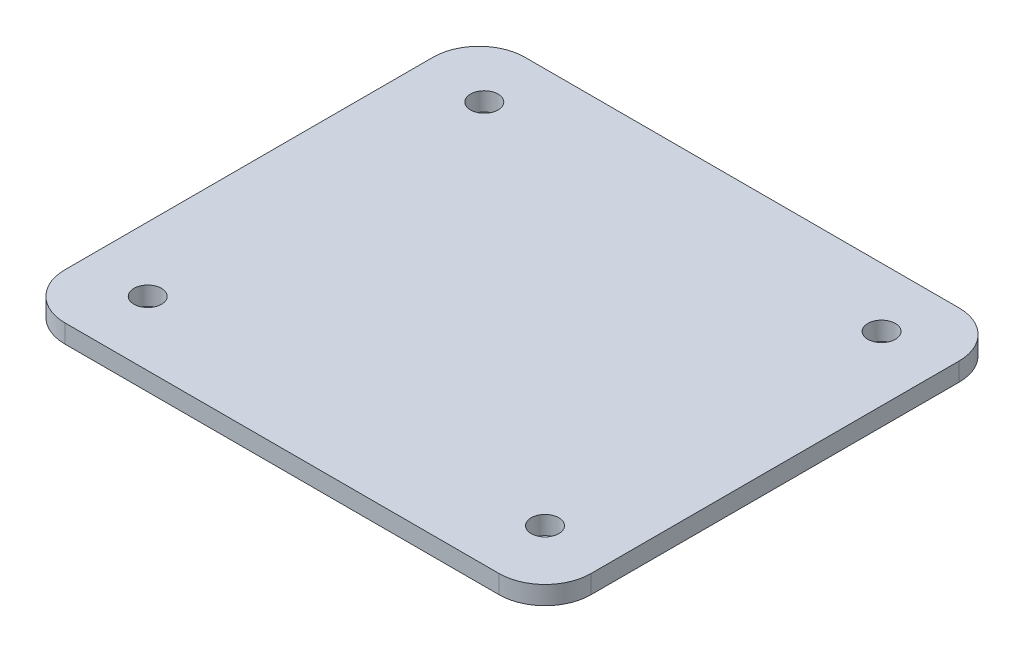
ISO-10303-21;
HEADER;
FILE_DESCRIPTION(('STEP AP214'),'2;1');
FILE_NAME('part.step','',(''),(''),'','','');
FILE_SCHEMA(('AUTOMOTIVE_DESIGN { 1 0 10303 214 1 1 1 1 }'));
ENDSEC;
DATA;
#1=APPLICATION_CONTEXT('core data for automotive mechanical design processes');
#2=APPLICATION_PROTOCOL_DEFINITION('international standard','automotive_design',2000,#1);
#3=PRODUCT_CONTEXT('',#1,'mechanical');
#4=PRODUCT('Part','Part','',(#3));
#5=PRODUCT_RELATED_PRODUCT_CATEGORY('part','',(#4));
#6=PRODUCT_DEFINITION_FORMATION('','',#4);
#7=PRODUCT_DEFINITION_CONTEXT('part definition',#1,'design');
#8=PRODUCT_DEFINITION('design','',#6,#7);
#9=PRODUCT_DEFINITION_SHAPE('','',#8);
#10=(LENGTH_UNIT() NAMED_UNIT(*) SI_UNIT(.MILLI.,.METRE.));
#11=(NAMED_UNIT(*) PLANE_ANGLE_UNIT() SI_UNIT($,.RADIAN.));
#12=(NAMED_UNIT(*) SI_UNIT($,.STERADIAN.) SOLID_ANGLE_UNIT());
#13=UNCERTAINTY_MEASURE_WITH_UNIT(LENGTH_MEASURE(1.E-05),#10,'distance_accuracy_value','');
#14=(GEOMETRIC_REPRESENTATION_CONTEXT(3) GLOBAL_UNCERTAINTY_ASSIGNED_CONTEXT((#13)) GLOBAL_UNIT_ASSIGNED_CONTEXT((#10,
#11,#12)) REPRESENTATION_CONTEXT('',''));
#15=CARTESIAN_POINT('',(0.,0.,0.));
#16=DIRECTION('',(0.,0.,1.));
#17=DIRECTION('',(1.,0.,0.));
#18=AXIS2_PLACEMENT_3D('',#15,#16,#17);
#19=CARTESIAN_POINT('',(0.,2.,0.));
#20=DIRECTION('',(0.,1.,0.));
#21=DIRECTION('',(0.,0.,1.));
#22=AXIS2_PLACEMENT_3D('',#19,#20,#21);
#23=PLANE('',#22);
#24=CARTESIAN_POINT('',(50.18,2.,43.));
#25=DIRECTION('',(0.,1.,0.));
#26=DIRECTION('',(0.,0.,1.));
#27=AXIS2_PLACEMENT_3D('',#24,#25,#26);
#28=CIRCLE('',#27,1.5);
#29=CARTESIAN_POINT('',(50.18,2.,44.5));
#30=VERTEX_POINT('',#29);
#31=EDGE_CURVE('E176',#30,#30,#28,.T.);
#32=ORIENTED_EDGE('',*,*,#31,.F.);
#33=EDGE_LOOP('',(#32));
#34=FACE_BOUND('',#33,.T.);
#35=CARTESIAN_POINT('',(7.,2.,6.42));
#36=DIRECTION('',(0.,1.,0.));
#37=DIRECTION('',(0.,0.,1.));
#38=AXIS2_PLACEMENT_3D('',#35,#36,#37);
#39=CIRCLE('',#38,1.5);
#40=CARTESIAN_POINT('',(7.,2.,7.92));
#41=VERTEX_POINT('',#40);
#42=EDGE_CURVE('E159',#41,#41,#39,.T.);
#43=ORIENTED_EDGE('',*,*,#42,.F.);
#44=EDGE_LOOP('',(#43));
#45=FACE_BOUND('',#44,.T.);
#46=DIRECTION('',(0.,0.,-1.));
#47=VECTOR('',#46,1.);
#48=CARTESIAN_POINT('',(57.18,2.,0.));
#49=LINE('',#48,#47);
#50=CARTESIAN_POINT('',(57.18,2.,45.));
#51=VERTEX_POINT('',#50);
#52=CARTESIAN_POINT('',(57.18,2.,5.));
#53=VERTEX_POINT('',#52);
#54=EDGE_CURVE('E163',#51,#53,#49,.T.);
#55=ORIENTED_EDGE('',*,*,#54,.T.);
#56=CARTESIAN_POINT('',(52.18,2.,5.));
#57=DIRECTION('',(0.,1.,0.));
#58=DIRECTION('',(0.,0.,1.));
#59=AXIS2_PLACEMENT_3D('',#56,#57,#58);
#60=CIRCLE('',#59,5.);
#61=CARTESIAN_POINT('',(52.18,2.,0.));
#62=VERTEX_POINT('',#61);
#63=EDGE_CURVE('E146',#53,#62,#60,.T.);
#64=ORIENTED_EDGE('',*,*,#63,.T.);
#65=DIRECTION('',(-1.,0.,0.));
#66=VECTOR('',#65,1.);
#67=CARTESIAN_POINT('',(0.,2.,0.));
#68=LINE('',#67,#66);
#69=CARTESIAN_POINT('',(5.,2.,0.));
#70=VERTEX_POINT('',#69);
#71=EDGE_CURVE('E117',#62,#70,#68,.T.);
#72=ORIENTED_EDGE('',*,*,#71,.T.);
#73=CARTESIAN_POINT('',(5.,2.,5.));
#74=DIRECTION('',(0.,1.,0.));
#75=DIRECTION('',(0.,0.,1.));
#76=AXIS2_PLACEMENT_3D('',#73,#74,#75);
#77=CIRCLE('',#76,5.);
#78=CARTESIAN_POINT('',(0.,2.,5.));
#79=VERTEX_POINT('',#78);
#80=EDGE_CURVE('E144',#70,#79,#77,.T.);
#81=ORIENTED_EDGE('',*,*,#80,.T.);
#82=DIRECTION('',(0.,0.,1.));
#83=VECTOR('',#82,1.);
#84=CARTESIAN_POINT('',(0.,2.,0.));
#85=LINE('',#84,#83);
#86=CARTESIAN_POINT('',(0.,2.,45.));
#87=VERTEX_POINT('',#86);
#88=EDGE_CURVE('E124',#79,#87,#85,.T.);
#89=ORIENTED_EDGE('',*,*,#88,.T.);
#90=CARTESIAN_POINT('',(5.00000000000001,2.,45.));
#91=DIRECTION('',(0.,1.,0.));
#92=DIRECTION('',(0.,0.,1.));
#93=AXIS2_PLACEMENT_3D('',#90,#91,#92);
#94=CIRCLE('',#93,5.);
#95=CARTESIAN_POINT('',(5.00000000000001,2.,50.));
#96=VERTEX_POINT('',#95);
#97=EDGE_CURVE('E52',#87,#96,#94,.T.);
#98=ORIENTED_EDGE('',*,*,#97,.T.);
#99=DIRECTION('',(1.,0.,0.));
#100=VECTOR('',#99,1.);
#101=CARTESIAN_POINT('',(0.,2.,50.));
#102=LINE('',#101,#100);
#103=CARTESIAN_POINT('',(52.18,2.,50.));
#104=VERTEX_POINT('',#103);
#105=EDGE_CURVE('E127',#96,#104,#102,.T.);
#106=ORIENTED_EDGE('',*,*,#105,.T.);
#107=CARTESIAN_POINT('',(52.18,2.,45.));
#108=DIRECTION('',(0.,1.,0.));
#109=DIRECTION('',(0.,0.,1.));
#110=AXIS2_PLACEMENT_3D('',#107,#108,#109);
#111=CIRCLE('',#110,5.);
#112=EDGE_CURVE('E142',#104,#51,#111,.T.);
#113=ORIENTED_EDGE('',*,*,#112,.T.);
#114=EDGE_LOOP('',(#55,#64,#72,#81,#89,#98,#106,#113));
#115=FACE_BOUND('',#114,.T.);
#116=CARTESIAN_POINT('',(50.18,2.,6.42));
#117=DIRECTION('',(0.,1.,0.));
#118=DIRECTION('',(0.,0.,1.));
#119=AXIS2_PLACEMENT_3D('',#116,#117,#118);
#120=CIRCLE('',#119,1.5);
#121=CARTESIAN_POINT('',(50.18,2.,7.92000000000001));
#122=VERTEX_POINT('',#121);
#123=EDGE_CURVE('E170',#122,#122,#120,.T.);
#124=ORIENTED_EDGE('',*,*,#123,.F.);
#125=EDGE_LOOP('',(#124));
#126=FACE_BOUND('',#125,.T.);
#127=CARTESIAN_POINT('',(7.,2.,43.));
#128=DIRECTION('',(0.,1.,0.));
#129=DIRECTION('',(0.,0.,1.));
#130=AXIS2_PLACEMENT_3D('',#127,#128,#129);
#131=CIRCLE('',#130,1.5);
#132=CARTESIAN_POINT('',(7.,2.,44.5));
#133=VERTEX_POINT('',#132);
#134=EDGE_CURVE('E182',#133,#133,#131,.T.);
#135=ORIENTED_EDGE('',*,*,#134,.F.);
#136=EDGE_LOOP('',(#135));
#137=FACE_BOUND('',#136,.T.);
#138=ADVANCED_FACE('F32',(#34,#45,#115,#126,#137),#23,.T.);
#139=CARTESIAN_POINT('',(0.,0.,0.));
#140=DIRECTION('',(0.,1.,0.));
#141=DIRECTION('',(0.,0.,1.));
#142=AXIS2_PLACEMENT_3D('',#139,#140,#141);
#143=PLANE('',#142);
#144=DIRECTION('',(-1.,0.,0.));
#145=VECTOR('',#144,1.);
#146=CARTESIAN_POINT('',(0.,0.,0.));
#147=LINE('',#146,#145);
#148=CARTESIAN_POINT('',(52.18,0.,0.));
#149=VERTEX_POINT('',#148);
#150=CARTESIAN_POINT('',(5.,0.,0.));
#151=VERTEX_POINT('',#150);
#152=EDGE_CURVE('E114',#149,#151,#147,.T.);
#153=ORIENTED_EDGE('',*,*,#152,.F.);
#154=CARTESIAN_POINT('',(52.18,0.,5.));
#155=DIRECTION('',(0.,1.,0.));
#156=DIRECTION('',(0.,0.,1.));
#157=AXIS2_PLACEMENT_3D('',#154,#155,#156);
#158=CIRCLE('',#157,5.);
#159=CARTESIAN_POINT('',(57.18,0.,5.));
#160=VERTEX_POINT('',#159);
#161=EDGE_CURVE('E97',#149,#160,#158,.F.);
#162=ORIENTED_EDGE('',*,*,#161,.T.);
#163=DIRECTION('',(0.,0.,-1.));
#164=VECTOR('',#163,1.);
#165=CARTESIAN_POINT('',(57.18,0.,0.));
#166=LINE('',#165,#164);
#167=CARTESIAN_POINT('',(57.18,0.,45.));
#168=VERTEX_POINT('',#167);
#169=EDGE_CURVE('E125',#168,#160,#166,.T.);
#170=ORIENTED_EDGE('',*,*,#169,.F.);
#171=CARTESIAN_POINT('',(52.18,0.,45.));
#172=DIRECTION('',(0.,1.,0.));
#173=DIRECTION('',(0.,0.,1.));
#174=AXIS2_PLACEMENT_3D('',#171,#172,#173);
#175=CIRCLE('',#174,5.);
#176=CARTESIAN_POINT('',(52.18,0.,50.));
#177=VERTEX_POINT('',#176);
#178=EDGE_CURVE('E135',#168,#177,#175,.F.);
#179=ORIENTED_EDGE('',*,*,#178,.T.);
#180=DIRECTION('',(1.,0.,0.));
#181=VECTOR('',#180,1.);
#182=CARTESIAN_POINT('',(0.,0.,50.));
#183=LINE('',#182,#181);
#184=CARTESIAN_POINT('',(5.00000000000001,0.,50.));
#185=VERTEX_POINT('',#184);
#186=EDGE_CURVE('E129',#185,#177,#183,.T.);
#187=ORIENTED_EDGE('',*,*,#186,.F.);
#188=CARTESIAN_POINT('',(5.00000000000001,0.,45.));
#189=DIRECTION('',(0.,1.,0.));
#190=DIRECTION('',(0.,0.,1.));
#191=AXIS2_PLACEMENT_3D('',#188,#189,#190);
#192=CIRCLE('',#191,5.);
#193=CARTESIAN_POINT('',(0.,0.,45.));
#194=VERTEX_POINT('',#193);
#195=EDGE_CURVE('E118',#185,#194,#192,.F.);
#196=ORIENTED_EDGE('',*,*,#195,.T.);
#197=DIRECTION('',(0.,0.,1.));
#198=VECTOR('',#197,1.);
#199=CARTESIAN_POINT('',(0.,0.,0.));
#200=LINE('',#199,#198);
#201=CARTESIAN_POINT('',(0.,0.,5.));
#202=VERTEX_POINT('',#201);
#203=EDGE_CURVE('E158',#202,#194,#200,.T.);
#204=ORIENTED_EDGE('',*,*,#203,.F.);
#205=CARTESIAN_POINT('',(5.,0.,5.));
#206=DIRECTION('',(0.,1.,0.));
#207=DIRECTION('',(0.,0.,1.));
#208=AXIS2_PLACEMENT_3D('',#205,#206,#207);
#209=CIRCLE('',#208,5.);
#210=EDGE_CURVE('E108',#202,#151,#209,.F.);
#211=ORIENTED_EDGE('',*,*,#210,.T.);
#212=EDGE_LOOP('',(#153,#162,#170,#179,#187,#196,#204,#211));
#213=FACE_BOUND('',#212,.T.);
#214=CARTESIAN_POINT('',(7.,0.,6.42));
#215=DIRECTION('',(0.,1.,0.));
#216=DIRECTION('',(0.,0.,1.));
#217=AXIS2_PLACEMENT_3D('',#214,#215,#216);
#218=CIRCLE('',#217,1.5);
#219=CARTESIAN_POINT('',(7.,0.,7.92));
#220=VERTEX_POINT('',#219);
#221=EDGE_CURVE('E167',#220,#220,#218,.T.);
#222=ORIENTED_EDGE('',*,*,#221,.T.);
#223=EDGE_LOOP('',(#222));
#224=FACE_BOUND('',#223,.T.);
#225=CARTESIAN_POINT('',(50.18,0.,6.42));
#226=DIRECTION('',(0.,1.,0.));
#227=DIRECTION('',(0.,0.,1.));
#228=AXIS2_PLACEMENT_3D('',#225,#226,#227);
#229=CIRCLE('',#228,1.5);
#230=CARTESIAN_POINT('',(50.18,0.,7.92000000000001));
#231=VERTEX_POINT('',#230);
#232=EDGE_CURVE('E173',#231,#231,#229,.T.);
#233=ORIENTED_EDGE('',*,*,#232,.T.);
#234=EDGE_LOOP('',(#233));
#235=FACE_BOUND('',#234,.T.);
#236=CARTESIAN_POINT('',(50.18,0.,43.));
#237=DIRECTION('',(0.,1.,0.));
#238=DIRECTION('',(0.,0.,1.));
#239=AXIS2_PLACEMENT_3D('',#236,#237,#238);
#240=CIRCLE('',#239,1.5);
#241=CARTESIAN_POINT('',(50.18,0.,44.5));
#242=VERTEX_POINT('',#241);
#243=EDGE_CURVE('E179',#242,#242,#240,.T.);
#244=ORIENTED_EDGE('',*,*,#243,.T.);
#245=EDGE_LOOP('',(#244));
#246=FACE_BOUND('',#245,.T.);
#247=CARTESIAN_POINT('',(7.,0.,43.));
#248=DIRECTION('',(0.,1.,0.));
#249=DIRECTION('',(0.,0.,1.));
#250=AXIS2_PLACEMENT_3D('',#247,#248,#249);
#251=CIRCLE('',#250,1.5);
#252=CARTESIAN_POINT('',(7.,0.,44.5));
#253=VERTEX_POINT('',#252);
#254=EDGE_CURVE('E185',#253,#253,#251,.T.);
#255=ORIENTED_EDGE('',*,*,#254,.T.);
#256=EDGE_LOOP('',(#255));
#257=FACE_BOUND('',#256,.T.);
#258=ADVANCED_FACE('F121',(#213,#224,#235,#246,#257),#143,.F.);
#259=CARTESIAN_POINT('',(0.,2.,0.));
#260=DIRECTION('',(1.,0.,0.));
#261=DIRECTION('',(0.,0.,-1.));
#262=AXIS2_PLACEMENT_3D('',#259,#260,#261);
#263=PLANE('',#262);
#264=ORIENTED_EDGE('',*,*,#88,.F.);
#265=DIRECTION('',(0.,-1.,0.));
#266=VECTOR('',#265,1.);
#267=CARTESIAN_POINT('',(0.,2.,5.));
#268=LINE('',#267,#266);
#269=EDGE_CURVE('E150',#79,#202,#268,.T.);
#270=ORIENTED_EDGE('',*,*,#269,.T.);
#271=ORIENTED_EDGE('',*,*,#203,.T.);
#272=DIRECTION('',(0.,-1.,0.));
#273=VECTOR('',#272,1.);
#274=CARTESIAN_POINT('',(0.,2.,45.));
#275=LINE('',#274,#273);
#276=EDGE_CURVE('E148',#194,#87,#275,.F.);
#277=ORIENTED_EDGE('',*,*,#276,.T.);
#278=EDGE_LOOP('',(#264,#270,#271,#277));
#279=FACE_BOUND('',#278,.T.);
#280=ADVANCED_FACE('F200',(#279),#263,.F.);
#281=CARTESIAN_POINT('',(0.,2.,50.));
#282=DIRECTION('',(0.,0.,-1.));
#283=DIRECTION('',(-1.,0.,0.));
#284=AXIS2_PLACEMENT_3D('',#281,#282,#283);
#285=PLANE('',#284);
#286=ORIENTED_EDGE('',*,*,#186,.T.);
#287=DIRECTION('',(0.,-1.,0.));
#288=VECTOR('',#287,1.);
#289=CARTESIAN_POINT('',(52.18,2.,50.));
#290=LINE('',#289,#288);
#291=EDGE_CURVE('E11',#177,#104,#290,.F.);
#292=ORIENTED_EDGE('',*,*,#291,.T.);
#293=ORIENTED_EDGE('',*,*,#105,.F.);
#294=DIRECTION('',(0.,-1.,0.));
#295=VECTOR('',#294,1.);
#296=CARTESIAN_POINT('',(5.00000000000001,2.,50.));
#297=LINE('',#296,#295);
#298=EDGE_CURVE('E40',#96,#185,#297,.T.);
#299=ORIENTED_EDGE('',*,*,#298,.T.);
#300=EDGE_LOOP('',(#286,#292,#293,#299));
#301=FACE_BOUND('',#300,.T.);
#302=ADVANCED_FACE('F155',(#301),#285,.F.);
#303=CARTESIAN_POINT('',(57.18,2.,0.));
#304=DIRECTION('',(-1.,0.,0.));
#305=DIRECTION('',(0.,0.,1.));
#306=AXIS2_PLACEMENT_3D('',#303,#304,#305);
#307=PLANE('',#306);
#308=ORIENTED_EDGE('',*,*,#169,.T.);
#309=DIRECTION('',(0.,-1.,0.));
#310=VECTOR('',#309,1.);
#311=CARTESIAN_POINT('',(57.18,2.,5.));
#312=LINE('',#311,#310);
#313=EDGE_CURVE('E102',#160,#53,#312,.F.);
#314=ORIENTED_EDGE('',*,*,#313,.T.);
#315=ORIENTED_EDGE('',*,*,#54,.F.);
#316=DIRECTION('',(0.,-1.,0.));
#317=VECTOR('',#316,1.);
#318=CARTESIAN_POINT('',(57.18,2.,45.));
#319=LINE('',#318,#317);
#320=EDGE_CURVE('E107',#51,#168,#319,.T.);
#321=ORIENTED_EDGE('',*,*,#320,.T.);
#322=EDGE_LOOP('',(#308,#314,#315,#321));
#323=FACE_BOUND('',#322,.T.);
#324=ADVANCED_FACE('F210',(#323),#307,.F.);
#325=CARTESIAN_POINT('',(0.,2.,0.));
#326=DIRECTION('',(0.,0.,1.));
#327=DIRECTION('',(1.,0.,0.));
#328=AXIS2_PLACEMENT_3D('',#325,#326,#327);
#329=PLANE('',#328);
#330=ORIENTED_EDGE('',*,*,#71,.F.);
#331=DIRECTION('',(0.,-1.,0.));
#332=VECTOR('',#331,1.);
#333=CARTESIAN_POINT('',(52.18,2.,0.));
#334=LINE('',#333,#332);
#335=EDGE_CURVE('E101',#62,#149,#334,.T.);
#336=ORIENTED_EDGE('',*,*,#335,.T.);
#337=ORIENTED_EDGE('',*,*,#152,.T.);
#338=DIRECTION('',(0.,-1.,0.));
#339=VECTOR('',#338,1.);
#340=CARTESIAN_POINT('',(5.,2.,0.));
#341=LINE('',#340,#339);
#342=EDGE_CURVE('E119',#151,#70,#341,.F.);
#343=ORIENTED_EDGE('',*,*,#342,.T.);
#344=EDGE_LOOP('',(#330,#336,#337,#343));
#345=FACE_BOUND('',#344,.T.);
#346=ADVANCED_FACE('F113',(#345),#329,.F.);
#347=CARTESIAN_POINT('',(7.,2.,6.42));
#348=DIRECTION('',(0.,-1.,0.));
#349=DIRECTION('',(0.,0.,-1.));
#350=AXIS2_PLACEMENT_3D('',#347,#348,#349);
#351=CYLINDRICAL_SURFACE('',#350,1.5);
#352=ORIENTED_EDGE('',*,*,#42,.T.);
#353=EDGE_LOOP('',(#352));
#354=FACE_BOUND('',#353,.T.);
#355=ORIENTED_EDGE('',*,*,#221,.F.);
#356=EDGE_LOOP('',(#355));
#357=FACE_BOUND('',#356,.T.);
#358=ADVANCED_FACE('F205',(#354,#357),#351,.F.);
#359=CARTESIAN_POINT('',(50.18,2.,6.42));
#360=DIRECTION('',(0.,-1.,0.));
#361=DIRECTION('',(0.,0.,-1.));
#362=AXIS2_PLACEMENT_3D('',#359,#360,#361);
#363=CYLINDRICAL_SURFACE('',#362,1.5);
#364=ORIENTED_EDGE('',*,*,#123,.T.);
#365=EDGE_LOOP('',(#364));
#366=FACE_BOUND('',#365,.T.);
#367=ORIENTED_EDGE('',*,*,#232,.F.);
#368=EDGE_LOOP('',(#367));
#369=FACE_BOUND('',#368,.T.);
#370=ADVANCED_FACE('F240',(#366,#369),#363,.F.);
#371=CARTESIAN_POINT('',(50.18,2.,43.));
#372=DIRECTION('',(0.,-1.,0.));
#373=DIRECTION('',(0.,0.,-1.));
#374=AXIS2_PLACEMENT_3D('',#371,#372,#373);
#375=CYLINDRICAL_SURFACE('',#374,1.5);
#376=ORIENTED_EDGE('',*,*,#31,.T.);
#377=EDGE_LOOP('',(#376));
#378=FACE_BOUND('',#377,.T.);
#379=ORIENTED_EDGE('',*,*,#243,.F.);
#380=EDGE_LOOP('',(#379));
#381=FACE_BOUND('',#380,.T.);
#382=ADVANCED_FACE('F243',(#378,#381),#375,.F.);
#383=CARTESIAN_POINT('',(7.,2.,43.));
#384=DIRECTION('',(0.,-1.,0.));
#385=DIRECTION('',(0.,0.,-1.));
#386=AXIS2_PLACEMENT_3D('',#383,#384,#385);
#387=CYLINDRICAL_SURFACE('',#386,1.5);
#388=ORIENTED_EDGE('',*,*,#134,.T.);
#389=EDGE_LOOP('',(#388));
#390=FACE_BOUND('',#389,.T.);
#391=ORIENTED_EDGE('',*,*,#254,.F.);
#392=EDGE_LOOP('',(#391));
#393=FACE_BOUND('',#392,.T.);
#394=ADVANCED_FACE('F191',(#390,#393),#387,.F.);
#395=CARTESIAN_POINT('',(52.18,2.,5.));
#396=DIRECTION('',(0.,-1.,0.));
#397=DIRECTION('',(0.,0.,-1.));
#398=AXIS2_PLACEMENT_3D('',#395,#396,#397);
#399=CYLINDRICAL_SURFACE('',#398,5.);
#400=ORIENTED_EDGE('',*,*,#63,.F.);
#401=ORIENTED_EDGE('',*,*,#313,.F.);
#402=ORIENTED_EDGE('',*,*,#161,.F.);
#403=ORIENTED_EDGE('',*,*,#335,.F.);
#404=EDGE_LOOP('',(#400,#401,#402,#403));
#405=FACE_BOUND('',#404,.T.);
#406=ADVANCED_FACE('F100',(#405),#399,.T.);
#407=CARTESIAN_POINT('',(5.,2.,5.));
#408=DIRECTION('',(0.,-1.,0.));
#409=DIRECTION('',(0.,0.,-1.));
#410=AXIS2_PLACEMENT_3D('',#407,#408,#409);
#411=CYLINDRICAL_SURFACE('',#410,5.);
#412=ORIENTED_EDGE('',*,*,#80,.F.);
#413=ORIENTED_EDGE('',*,*,#342,.F.);
#414=ORIENTED_EDGE('',*,*,#210,.F.);
#415=ORIENTED_EDGE('',*,*,#269,.F.);
#416=EDGE_LOOP('',(#412,#413,#414,#415));
#417=FACE_BOUND('',#416,.T.);
#418=ADVANCED_FACE('F221',(#417),#411,.T.);
#419=CARTESIAN_POINT('',(52.18,2.,45.));
#420=DIRECTION('',(0.,-1.,0.));
#421=DIRECTION('',(0.,0.,-1.));
#422=AXIS2_PLACEMENT_3D('',#419,#420,#421);
#423=CYLINDRICAL_SURFACE('',#422,5.);
#424=ORIENTED_EDGE('',*,*,#112,.F.);
#425=ORIENTED_EDGE('',*,*,#291,.F.);
#426=ORIENTED_EDGE('',*,*,#178,.F.);
#427=ORIENTED_EDGE('',*,*,#320,.F.);
#428=EDGE_LOOP('',(#424,#425,#426,#427));
#429=FACE_BOUND('',#428,.T.);
#430=ADVANCED_FACE('F223',(#429),#423,.T.);
#431=CARTESIAN_POINT('',(5.00000000000001,2.,45.));
#432=DIRECTION('',(0.,-1.,0.));
#433=DIRECTION('',(0.,0.,-1.));
#434=AXIS2_PLACEMENT_3D('',#431,#432,#433);
#435=CYLINDRICAL_SURFACE('',#434,5.);
#436=ORIENTED_EDGE('',*,*,#97,.F.);
#437=ORIENTED_EDGE('',*,*,#276,.F.);
#438=ORIENTED_EDGE('',*,*,#195,.F.);
#439=ORIENTED_EDGE('',*,*,#298,.F.);
#440=EDGE_LOOP('',(#436,#437,#438,#439));
#441=FACE_BOUND('',#440,.T.);
#442=ADVANCED_FACE('F34',(#441),#435,.T.);
#443=CLOSED_SHELL('',(#138,#258,#280,#302,#324,#346,#358,#370,#382,#394,#406,#418,#430,#442));
#444=MANIFOLD_SOLID_BREP('B2',#443);
#445=ADVANCED_BREP_SHAPE_REPRESENTATION('',(#18,#444),#14);
#446=SHAPE_DEFINITION_REPRESENTATION(#9,#445);
ENDSEC;
END-ISO-10303-21;
